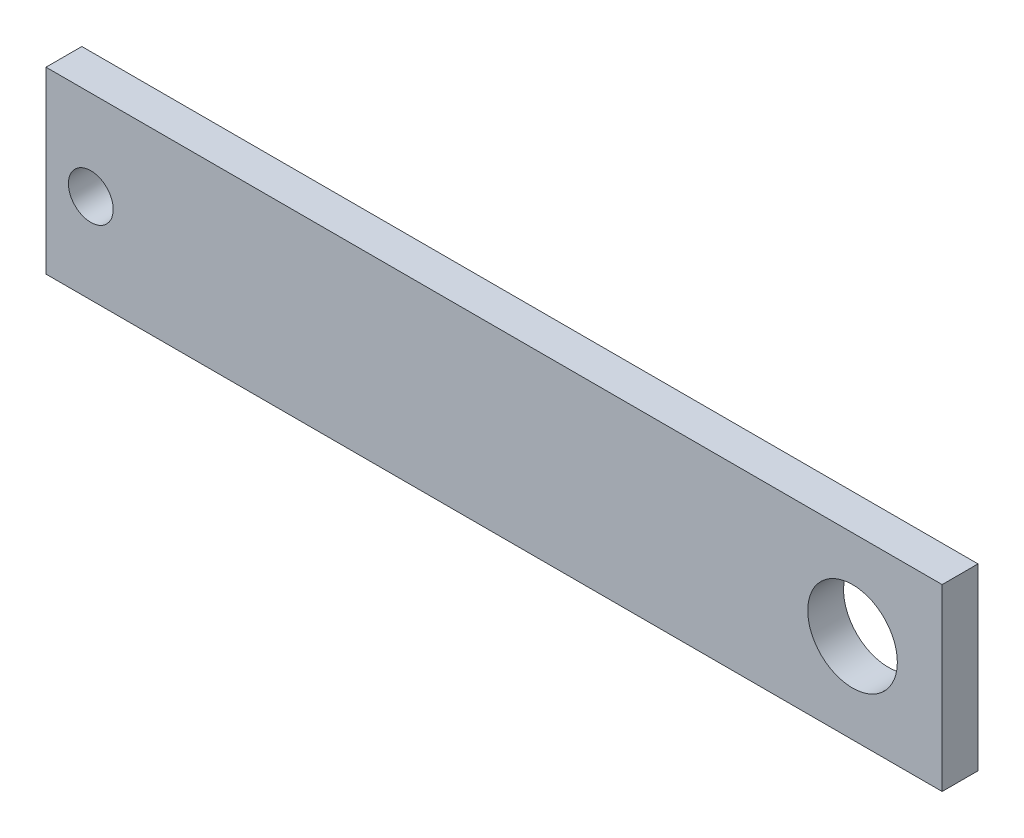
ISO-10303-21;
HEADER;
FILE_DESCRIPTION(('STEP AP214'),'2;1');
FILE_NAME('part.step','',(''),(''),'','','');
FILE_SCHEMA(('AUTOMOTIVE_DESIGN { 1 0 10303 214 1 1 1 1 }'));
ENDSEC;
DATA;
#1=APPLICATION_CONTEXT('core data for automotive mechanical design processes');
#2=APPLICATION_PROTOCOL_DEFINITION('international standard','automotive_design',2000,#1);
#3=PRODUCT_CONTEXT('',#1,'mechanical');
#4=PRODUCT('Part','Part','',(#3));
#5=PRODUCT_RELATED_PRODUCT_CATEGORY('part','',(#4));
#6=PRODUCT_DEFINITION_FORMATION('','',#4);
#7=PRODUCT_DEFINITION_CONTEXT('part definition',#1,'design');
#8=PRODUCT_DEFINITION('design','',#6,#7);
#9=PRODUCT_DEFINITION_SHAPE('','',#8);
#10=(LENGTH_UNIT() NAMED_UNIT(*) SI_UNIT(.MILLI.,.METRE.));
#11=(NAMED_UNIT(*) PLANE_ANGLE_UNIT() SI_UNIT($,.RADIAN.));
#12=(NAMED_UNIT(*) SI_UNIT($,.STERADIAN.) SOLID_ANGLE_UNIT());
#13=UNCERTAINTY_MEASURE_WITH_UNIT(LENGTH_MEASURE(1.E-05),#10,'distance_accuracy_value','');
#14=(GEOMETRIC_REPRESENTATION_CONTEXT(3) GLOBAL_UNCERTAINTY_ASSIGNED_CONTEXT((#13)) GLOBAL_UNIT_ASSIGNED_CONTEXT((#10,
#11,#12)) REPRESENTATION_CONTEXT('',''));
#15=CARTESIAN_POINT('',(0.,0.,0.));
#16=DIRECTION('',(0.,0.,1.));
#17=DIRECTION('',(1.,0.,0.));
#18=AXIS2_PLACEMENT_3D('',#15,#16,#17);
#19=CARTESIAN_POINT('',(0.,0.,4.));
#20=DIRECTION('',(0.,0.,-1.));
#21=DIRECTION('',(-1.,0.,0.));
#22=AXIS2_PLACEMENT_3D('',#19,#20,#21);
#23=PLANE('',#22);
#24=DIRECTION('',(0.,-1.,0.));
#25=VECTOR('',#24,1.);
#26=CARTESIAN_POINT('',(0.,0.,4.));
#27=LINE('',#26,#25);
#28=CARTESIAN_POINT('',(0.,20.,4.));
#29=VERTEX_POINT('',#28);
#30=CARTESIAN_POINT('',(0.,0.,4.));
#31=VERTEX_POINT('',#30);
#32=EDGE_CURVE('E99',#29,#31,#27,.T.);
#33=ORIENTED_EDGE('',*,*,#32,.T.);
#34=DIRECTION('',(1.,0.,0.));
#35=VECTOR('',#34,1.);
#36=CARTESIAN_POINT('',(0.,0.,4.));
#37=LINE('',#36,#35);
#38=CARTESIAN_POINT('',(100.,0.,4.));
#39=VERTEX_POINT('',#38);
#40=EDGE_CURVE('E94',#31,#39,#37,.T.);
#41=ORIENTED_EDGE('',*,*,#40,.T.);
#42=DIRECTION('',(0.,1.,0.));
#43=VECTOR('',#42,1.);
#44=CARTESIAN_POINT('',(100.,0.,4.));
#45=LINE('',#44,#43);
#46=CARTESIAN_POINT('',(100.,20.,4.));
#47=VERTEX_POINT('',#46);
#48=EDGE_CURVE('E97',#39,#47,#45,.T.);
#49=ORIENTED_EDGE('',*,*,#48,.T.);
#50=DIRECTION('',(-1.,0.,0.));
#51=VECTOR('',#50,1.);
#52=CARTESIAN_POINT('',(0.,20.,4.));
#53=LINE('',#52,#51);
#54=EDGE_CURVE('E64',#47,#29,#53,.T.);
#55=ORIENTED_EDGE('',*,*,#54,.T.);
#56=EDGE_LOOP('',(#33,#41,#49,#55));
#57=FACE_BOUND('',#56,.T.);
#58=CARTESIAN_POINT('',(5.,10.,4.));
#59=DIRECTION('',(0.,0.,1.));
#60=DIRECTION('',(1.,0.,0.));
#61=AXIS2_PLACEMENT_3D('',#58,#59,#60);
#62=CIRCLE('',#61,2.5);
#63=CARTESIAN_POINT('',(7.5,10.,4.));
#64=VERTEX_POINT('',#63);
#65=EDGE_CURVE('E123',#64,#64,#62,.T.);
#66=ORIENTED_EDGE('',*,*,#65,.F.);
#67=EDGE_LOOP('',(#66));
#68=FACE_BOUND('',#67,.T.);
#69=CARTESIAN_POINT('',(90.,10.,4.));
#70=DIRECTION('',(0.,0.,1.));
#71=DIRECTION('',(1.,0.,0.));
#72=AXIS2_PLACEMENT_3D('',#69,#70,#71);
#73=CIRCLE('',#72,5.);
#74=CARTESIAN_POINT('',(95.,10.,4.));
#75=VERTEX_POINT('',#74);
#76=EDGE_CURVE('E134',#75,#75,#73,.T.);
#77=ORIENTED_EDGE('',*,*,#76,.F.);
#78=EDGE_LOOP('',(#77));
#79=FACE_BOUND('',#78,.T.);
#80=ADVANCED_FACE('F46',(#57,#68,#79),#23,.F.);
#81=CARTESIAN_POINT('',(0.,0.,0.));
#82=DIRECTION('',(0.,0.,-1.));
#83=DIRECTION('',(-1.,0.,0.));
#84=AXIS2_PLACEMENT_3D('',#81,#82,#83);
#85=PLANE('',#84);
#86=CARTESIAN_POINT('',(5.,10.,0.));
#87=DIRECTION('',(0.,0.,1.));
#88=DIRECTION('',(1.,0.,0.));
#89=AXIS2_PLACEMENT_3D('',#86,#87,#88);
#90=CIRCLE('',#89,2.5);
#91=CARTESIAN_POINT('',(7.5,10.,0.));
#92=VERTEX_POINT('',#91);
#93=EDGE_CURVE('E130',#92,#92,#90,.T.);
#94=ORIENTED_EDGE('',*,*,#93,.T.);
#95=EDGE_LOOP('',(#94));
#96=FACE_BOUND('',#95,.T.);
#97=DIRECTION('',(0.,-1.,0.));
#98=VECTOR('',#97,1.);
#99=CARTESIAN_POINT('',(0.,0.,0.));
#100=LINE('',#99,#98);
#101=CARTESIAN_POINT('',(0.,20.,0.));
#102=VERTEX_POINT('',#101);
#103=CARTESIAN_POINT('',(0.,0.,0.));
#104=VERTEX_POINT('',#103);
#105=EDGE_CURVE('E129',#102,#104,#100,.T.);
#106=ORIENTED_EDGE('',*,*,#105,.F.);
#107=DIRECTION('',(-1.,0.,0.));
#108=VECTOR('',#107,1.);
#109=CARTESIAN_POINT('',(0.,20.,0.));
#110=LINE('',#109,#108);
#111=CARTESIAN_POINT('',(100.,20.,0.));
#112=VERTEX_POINT('',#111);
#113=EDGE_CURVE('E87',#112,#102,#110,.T.);
#114=ORIENTED_EDGE('',*,*,#113,.F.);
#115=DIRECTION('',(0.,1.,0.));
#116=VECTOR('',#115,1.);
#117=CARTESIAN_POINT('',(100.,0.,0.));
#118=LINE('',#117,#116);
#119=CARTESIAN_POINT('',(100.,0.,0.));
#120=VERTEX_POINT('',#119);
#121=EDGE_CURVE('E81',#120,#112,#118,.T.);
#122=ORIENTED_EDGE('',*,*,#121,.F.);
#123=DIRECTION('',(1.,0.,0.));
#124=VECTOR('',#123,1.);
#125=CARTESIAN_POINT('',(0.,0.,0.));
#126=LINE('',#125,#124);
#127=EDGE_CURVE('E104',#104,#120,#126,.T.);
#128=ORIENTED_EDGE('',*,*,#127,.F.);
#129=EDGE_LOOP('',(#106,#114,#122,#128));
#130=FACE_BOUND('',#129,.T.);
#131=CARTESIAN_POINT('',(90.,10.,0.));
#132=DIRECTION('',(0.,0.,1.));
#133=DIRECTION('',(1.,0.,0.));
#134=AXIS2_PLACEMENT_3D('',#131,#132,#133);
#135=CIRCLE('',#134,5.);
#136=CARTESIAN_POINT('',(95.,10.,0.));
#137=VERTEX_POINT('',#136);
#138=EDGE_CURVE('E131',#137,#137,#135,.T.);
#139=ORIENTED_EDGE('',*,*,#138,.T.);
#140=EDGE_LOOP('',(#139));
#141=FACE_BOUND('',#140,.T.);
#142=ADVANCED_FACE('F149',(#96,#130,#141),#85,.T.);
#143=CARTESIAN_POINT('',(0.,0.,4.));
#144=DIRECTION('',(1.,0.,0.));
#145=DIRECTION('',(0.,0.,-1.));
#146=AXIS2_PLACEMENT_3D('',#143,#144,#145);
#147=PLANE('',#146);
#148=ORIENTED_EDGE('',*,*,#105,.T.);
#149=DIRECTION('',(0.,0.,-1.));
#150=VECTOR('',#149,1.);
#151=CARTESIAN_POINT('',(0.,0.,4.));
#152=LINE('',#151,#150);
#153=EDGE_CURVE('E12',#31,#104,#152,.T.);
#154=ORIENTED_EDGE('',*,*,#153,.F.);
#155=ORIENTED_EDGE('',*,*,#32,.F.);
#156=DIRECTION('',(0.,0.,-1.));
#157=VECTOR('',#156,1.);
#158=CARTESIAN_POINT('',(0.,20.,4.));
#159=LINE('',#158,#157);
#160=EDGE_CURVE('E111',#29,#102,#159,.T.);
#161=ORIENTED_EDGE('',*,*,#160,.T.);
#162=EDGE_LOOP('',(#148,#154,#155,#161));
#163=FACE_BOUND('',#162,.T.);
#164=ADVANCED_FACE('F48',(#163),#147,.F.);
#165=CARTESIAN_POINT('',(0.,0.,4.));
#166=DIRECTION('',(0.,1.,0.));
#167=DIRECTION('',(0.,0.,1.));
#168=AXIS2_PLACEMENT_3D('',#165,#166,#167);
#169=PLANE('',#168);
#170=ORIENTED_EDGE('',*,*,#127,.T.);
#171=DIRECTION('',(0.,0.,-1.));
#172=VECTOR('',#171,1.);
#173=CARTESIAN_POINT('',(100.,0.,4.));
#174=LINE('',#173,#172);
#175=EDGE_CURVE('E56',#39,#120,#174,.T.);
#176=ORIENTED_EDGE('',*,*,#175,.F.);
#177=ORIENTED_EDGE('',*,*,#40,.F.);
#178=ORIENTED_EDGE('',*,*,#153,.T.);
#179=EDGE_LOOP('',(#170,#176,#177,#178));
#180=FACE_BOUND('',#179,.T.);
#181=ADVANCED_FACE('F103',(#180),#169,.F.);
#182=CARTESIAN_POINT('',(100.,0.,4.));
#183=DIRECTION('',(-1.,0.,0.));
#184=DIRECTION('',(0.,0.,1.));
#185=AXIS2_PLACEMENT_3D('',#182,#183,#184);
#186=PLANE('',#185);
#187=ORIENTED_EDGE('',*,*,#121,.T.);
#188=DIRECTION('',(0.,0.,-1.));
#189=VECTOR('',#188,1.);
#190=CARTESIAN_POINT('',(100.,20.,4.));
#191=LINE('',#190,#189);
#192=EDGE_CURVE('E106',#47,#112,#191,.T.);
#193=ORIENTED_EDGE('',*,*,#192,.F.);
#194=ORIENTED_EDGE('',*,*,#48,.F.);
#195=ORIENTED_EDGE('',*,*,#175,.T.);
#196=EDGE_LOOP('',(#187,#193,#194,#195));
#197=FACE_BOUND('',#196,.T.);
#198=ADVANCED_FACE('F107',(#197),#186,.F.);
#199=CARTESIAN_POINT('',(0.,20.,4.));
#200=DIRECTION('',(0.,-1.,0.));
#201=DIRECTION('',(0.,0.,-1.));
#202=AXIS2_PLACEMENT_3D('',#199,#200,#201);
#203=PLANE('',#202);
#204=ORIENTED_EDGE('',*,*,#113,.T.);
#205=ORIENTED_EDGE('',*,*,#160,.F.);
#206=ORIENTED_EDGE('',*,*,#54,.F.);
#207=ORIENTED_EDGE('',*,*,#192,.T.);
#208=EDGE_LOOP('',(#204,#205,#206,#207));
#209=FACE_BOUND('',#208,.T.);
#210=ADVANCED_FACE('F146',(#209),#203,.F.);
#211=CARTESIAN_POINT('',(5.,10.,4.));
#212=DIRECTION('',(0.,0.,-1.));
#213=DIRECTION('',(-1.,0.,0.));
#214=AXIS2_PLACEMENT_3D('',#211,#212,#213);
#215=CYLINDRICAL_SURFACE('',#214,2.5);
#216=ORIENTED_EDGE('',*,*,#65,.T.);
#217=EDGE_LOOP('',(#216));
#218=FACE_BOUND('',#217,.T.);
#219=ORIENTED_EDGE('',*,*,#93,.F.);
#220=EDGE_LOOP('',(#219));
#221=FACE_BOUND('',#220,.T.);
#222=ADVANCED_FACE('F163',(#218,#221),#215,.F.);
#223=CARTESIAN_POINT('',(90.,10.,4.));
#224=DIRECTION('',(0.,0.,-1.));
#225=DIRECTION('',(-1.,0.,0.));
#226=AXIS2_PLACEMENT_3D('',#223,#224,#225);
#227=CYLINDRICAL_SURFACE('',#226,5.);
#228=ORIENTED_EDGE('',*,*,#76,.T.);
#229=EDGE_LOOP('',(#228));
#230=FACE_BOUND('',#229,.T.);
#231=ORIENTED_EDGE('',*,*,#138,.F.);
#232=EDGE_LOOP('',(#231));
#233=FACE_BOUND('',#232,.T.);
#234=ADVANCED_FACE('F161',(#230,#233),#227,.F.);
#235=CLOSED_SHELL('',(#80,#142,#164,#181,#198,#210,#222,#234));
#236=MANIFOLD_SOLID_BREP('B2',#235);
#237=ADVANCED_BREP_SHAPE_REPRESENTATION('',(#18,#236),#14);
#238=SHAPE_DEFINITION_REPRESENTATION(#9,#237);
ENDSEC;
END-ISO-10303-21;
